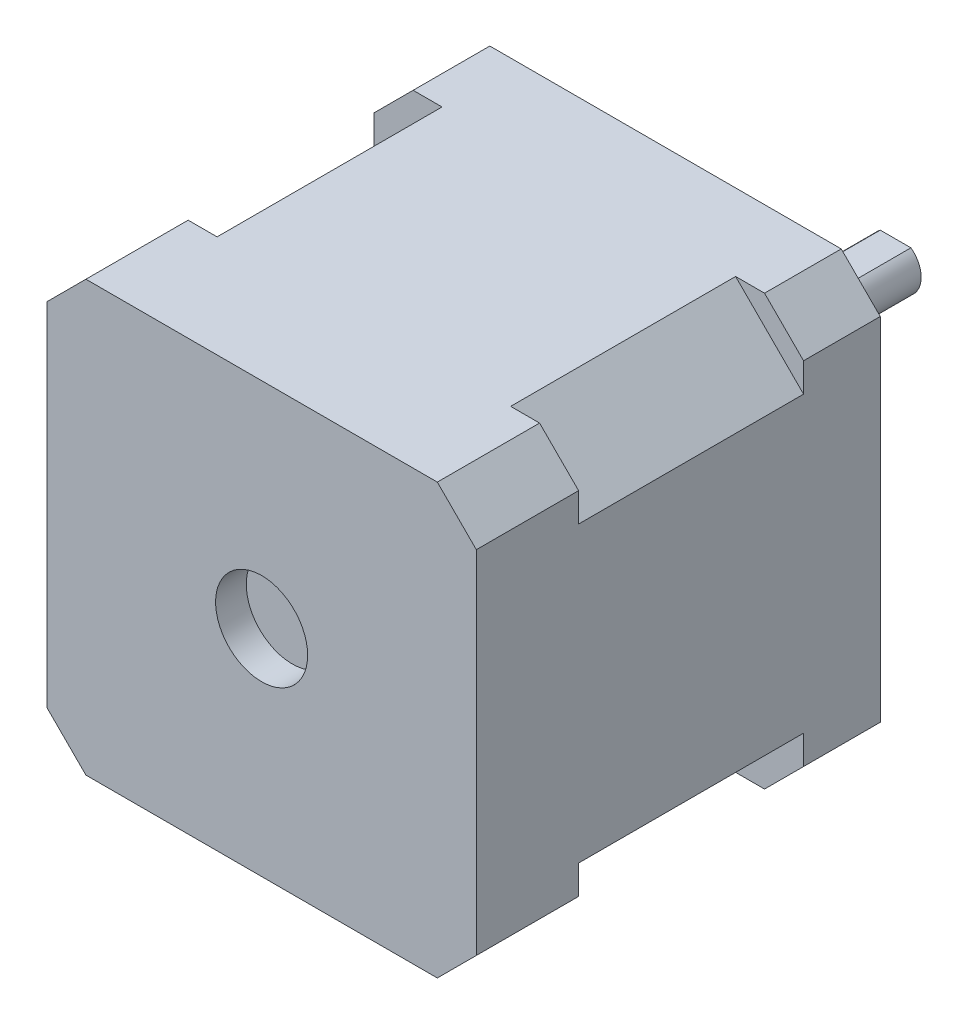
ISO-10303-21;
HEADER;
FILE_DESCRIPTION(('STEP AP214'),'2;1');
FILE_NAME('part.step','',(''),(''),'','','');
FILE_SCHEMA(('AUTOMOTIVE_DESIGN { 1 0 10303 214 1 1 1 1 }'));
ENDSEC;
DATA;
#1=APPLICATION_CONTEXT('core data for automotive mechanical design processes');
#2=APPLICATION_PROTOCOL_DEFINITION('international standard','automotive_design',2000,#1);
#3=PRODUCT_CONTEXT('',#1,'mechanical');
#4=PRODUCT('Part','Part','',(#3));
#5=PRODUCT_RELATED_PRODUCT_CATEGORY('part','',(#4));
#6=PRODUCT_DEFINITION_FORMATION('','',#4);
#7=PRODUCT_DEFINITION_CONTEXT('part definition',#1,'design');
#8=PRODUCT_DEFINITION('design','',#6,#7);
#9=PRODUCT_DEFINITION_SHAPE('','',#8);
#10=(LENGTH_UNIT() NAMED_UNIT(*) SI_UNIT(.MILLI.,.METRE.));
#11=(NAMED_UNIT(*) PLANE_ANGLE_UNIT() SI_UNIT($,.RADIAN.));
#12=(NAMED_UNIT(*) SI_UNIT($,.STERADIAN.) SOLID_ANGLE_UNIT());
#13=UNCERTAINTY_MEASURE_WITH_UNIT(LENGTH_MEASURE(1.E-05),#10,'distance_accuracy_value','');
#14=(GEOMETRIC_REPRESENTATION_CONTEXT(3) GLOBAL_UNCERTAINTY_ASSIGNED_CONTEXT((#13)) GLOBAL_UNIT_ASSIGNED_CONTEXT((#10,
#11,#12)) REPRESENTATION_CONTEXT('',''));
#15=CARTESIAN_POINT('',(0.,0.,0.));
#16=DIRECTION('',(0.,0.,1.));
#17=DIRECTION('',(1.,0.,0.));
#18=AXIS2_PLACEMENT_3D('',#15,#16,#17);
#19=CARTESIAN_POINT('',(21.,17.1837661840736,39.5));
#20=DIRECTION('',(-0.707106781186551,-0.707106781186544,0.));
#21=DIRECTION('',(0.707106781186544,-0.707106781186551,0.));
#22=AXIS2_PLACEMENT_3D('',#19,#20,#21);
#23=PLANE('',#22);
#24=DIRECTION('',(0.707106781186544,-0.707106781186551,0.));
#25=VECTOR('',#24,1.);
#26=CARTESIAN_POINT('',(21.,17.1837661840736,29.5));
#27=LINE('',#26,#25);
#28=CARTESIAN_POINT('',(17.1837661840736,21.,29.5));
#29=VERTEX_POINT('',#28);
#30=CARTESIAN_POINT('',(21.,17.1837661840736,29.5));
#31=VERTEX_POINT('',#30);
#32=EDGE_CURVE('E392',#29,#31,#27,.T.);
#33=ORIENTED_EDGE('',*,*,#32,.F.);
#34=DIRECTION('',(0.,0.,-1.));
#35=VECTOR('',#34,1.);
#36=CARTESIAN_POINT('',(17.1837661840736,21.,39.5));
#37=LINE('',#36,#35);
#38=CARTESIAN_POINT('',(17.1837661840736,21.,39.5));
#39=VERTEX_POINT('',#38);
#40=EDGE_CURVE('E309',#39,#29,#37,.T.);
#41=ORIENTED_EDGE('',*,*,#40,.F.);
#42=DIRECTION('',(-0.707106781186544,0.707106781186551,0.));
#43=VECTOR('',#42,1.);
#44=CARTESIAN_POINT('',(21.,17.1837661840736,39.5));
#45=LINE('',#44,#43);
#46=CARTESIAN_POINT('',(21.,17.1837661840736,39.5));
#47=VERTEX_POINT('',#46);
#48=EDGE_CURVE('E310',#47,#39,#45,.T.);
#49=ORIENTED_EDGE('',*,*,#48,.F.);
#50=DIRECTION('',(0.,0.,-1.));
#51=VECTOR('',#50,1.);
#52=CARTESIAN_POINT('',(21.,17.1837661840736,39.5));
#53=LINE('',#52,#51);
#54=EDGE_CURVE('E350',#47,#31,#53,.T.);
#55=ORIENTED_EDGE('',*,*,#54,.T.);
#56=EDGE_LOOP('',(#33,#41,#49,#55));
#57=FACE_BOUND('',#56,.T.);
#58=ADVANCED_FACE('F40',(#57),#23,.F.);
#59=CARTESIAN_POINT('',(-21.,17.1837661840736,39.5));
#60=DIRECTION('',(0.707106781186548,-0.707106781186548,0.));
#61=DIRECTION('',(0.707106781186548,0.707106781186548,0.));
#62=AXIS2_PLACEMENT_3D('',#59,#60,#61);
#63=PLANE('',#62);
#64=DIRECTION('',(0.707106781186548,0.707106781186548,0.));
#65=VECTOR('',#64,1.);
#66=CARTESIAN_POINT('',(-21.,17.1837661840736,29.5));
#67=LINE('',#66,#65);
#68=CARTESIAN_POINT('',(-21.,17.1837661840736,29.5));
#69=VERTEX_POINT('',#68);
#70=CARTESIAN_POINT('',(-17.1837661840736,21.,29.5));
#71=VERTEX_POINT('',#70);
#72=EDGE_CURVE('E428',#69,#71,#67,.T.);
#73=ORIENTED_EDGE('',*,*,#72,.F.);
#74=DIRECTION('',(0.,0.,-1.));
#75=VECTOR('',#74,1.);
#76=CARTESIAN_POINT('',(-21.,17.1837661840736,39.5));
#77=LINE('',#76,#75);
#78=CARTESIAN_POINT('',(-21.,17.1837661840736,39.5));
#79=VERTEX_POINT('',#78);
#80=EDGE_CURVE('E369',#79,#69,#77,.T.);
#81=ORIENTED_EDGE('',*,*,#80,.F.);
#82=DIRECTION('',(-0.707106781186548,-0.707106781186548,0.));
#83=VECTOR('',#82,1.);
#84=CARTESIAN_POINT('',(-21.,17.1837661840736,39.5));
#85=LINE('',#84,#83);
#86=CARTESIAN_POINT('',(-17.1837661840736,21.,39.5));
#87=VERTEX_POINT('',#86);
#88=EDGE_CURVE('E316',#87,#79,#85,.T.);
#89=ORIENTED_EDGE('',*,*,#88,.F.);
#90=DIRECTION('',(0.,0.,-1.));
#91=VECTOR('',#90,1.);
#92=CARTESIAN_POINT('',(-17.1837661840736,21.,39.5));
#93=LINE('',#92,#91);
#94=EDGE_CURVE('E373',#87,#71,#93,.T.);
#95=ORIENTED_EDGE('',*,*,#94,.T.);
#96=EDGE_LOOP('',(#73,#81,#89,#95));
#97=FACE_BOUND('',#96,.T.);
#98=ADVANCED_FACE('F523',(#97),#63,.F.);
#99=CARTESIAN_POINT('',(-17.1837661840736,-21.,39.5));
#100=DIRECTION('',(0.707106781186548,0.707106781186548,0.));
#101=DIRECTION('',(-0.707106781186548,0.707106781186548,0.));
#102=AXIS2_PLACEMENT_3D('',#99,#100,#101);
#103=PLANE('',#102);
#104=DIRECTION('',(-0.707106781186548,0.707106781186548,0.));
#105=VECTOR('',#104,1.);
#106=CARTESIAN_POINT('',(-17.1837661840736,-21.,29.5));
#107=LINE('',#106,#105);
#108=CARTESIAN_POINT('',(-17.1837661840736,-21.,29.5));
#109=VERTEX_POINT('',#108);
#110=CARTESIAN_POINT('',(-21.,-17.1837661840736,29.5));
#111=VERTEX_POINT('',#110);
#112=EDGE_CURVE('E423',#109,#111,#107,.T.);
#113=ORIENTED_EDGE('',*,*,#112,.F.);
#114=DIRECTION('',(0.,0.,-1.));
#115=VECTOR('',#114,1.);
#116=CARTESIAN_POINT('',(-17.1837661840736,-21.,39.5));
#117=LINE('',#116,#115);
#118=CARTESIAN_POINT('',(-17.1837661840736,-21.,39.5));
#119=VERTEX_POINT('',#118);
#120=EDGE_CURVE('E362',#119,#109,#117,.T.);
#121=ORIENTED_EDGE('',*,*,#120,.F.);
#122=DIRECTION('',(0.707106781186548,-0.707106781186548,0.));
#123=VECTOR('',#122,1.);
#124=CARTESIAN_POINT('',(-17.1837661840736,-21.,39.5));
#125=LINE('',#124,#123);
#126=CARTESIAN_POINT('',(-21.,-17.1837661840736,39.5));
#127=VERTEX_POINT('',#126);
#128=EDGE_CURVE('E320',#127,#119,#125,.T.);
#129=ORIENTED_EDGE('',*,*,#128,.F.);
#130=DIRECTION('',(0.,0.,-1.));
#131=VECTOR('',#130,1.);
#132=CARTESIAN_POINT('',(-21.,-17.1837661840736,39.5));
#133=LINE('',#132,#131);
#134=EDGE_CURVE('E365',#127,#111,#133,.T.);
#135=ORIENTED_EDGE('',*,*,#134,.T.);
#136=EDGE_LOOP('',(#113,#121,#129,#135));
#137=FACE_BOUND('',#136,.T.);
#138=ADVANCED_FACE('F514',(#137),#103,.F.);
#139=CARTESIAN_POINT('',(17.1837661840735,-21.,39.5));
#140=DIRECTION('',(-0.707106781186548,0.707106781186548,0.));
#141=DIRECTION('',(-0.707106781186548,-0.707106781186548,0.));
#142=AXIS2_PLACEMENT_3D('',#139,#140,#141);
#143=PLANE('',#142);
#144=DIRECTION('',(-0.707106781186548,-0.707106781186548,0.));
#145=VECTOR('',#144,1.);
#146=CARTESIAN_POINT('',(17.1837661840735,-21.,29.5));
#147=LINE('',#146,#145);
#148=CARTESIAN_POINT('',(21.,-17.1837661840735,29.5));
#149=VERTEX_POINT('',#148);
#150=CARTESIAN_POINT('',(17.1837661840735,-21.,29.5));
#151=VERTEX_POINT('',#150);
#152=EDGE_CURVE('E413',#149,#151,#147,.T.);
#153=ORIENTED_EDGE('',*,*,#152,.F.);
#154=DIRECTION('',(0.,0.,-1.));
#155=VECTOR('',#154,1.);
#156=CARTESIAN_POINT('',(21.,-17.1837661840735,39.5));
#157=LINE('',#156,#155);
#158=CARTESIAN_POINT('',(21.,-17.1837661840735,39.5));
#159=VERTEX_POINT('',#158);
#160=EDGE_CURVE('E354',#159,#149,#157,.T.);
#161=ORIENTED_EDGE('',*,*,#160,.F.);
#162=DIRECTION('',(0.707106781186548,0.707106781186548,0.));
#163=VECTOR('',#162,1.);
#164=CARTESIAN_POINT('',(17.1837661840735,-21.,39.5));
#165=LINE('',#164,#163);
#166=CARTESIAN_POINT('',(17.1837661840735,-21.,39.5));
#167=VERTEX_POINT('',#166);
#168=EDGE_CURVE('E324',#167,#159,#165,.T.);
#169=ORIENTED_EDGE('',*,*,#168,.F.);
#170=DIRECTION('',(0.,0.,-1.));
#171=VECTOR('',#170,1.);
#172=CARTESIAN_POINT('',(17.1837661840735,-21.,39.5));
#173=LINE('',#172,#171);
#174=EDGE_CURVE('E358',#167,#151,#173,.T.);
#175=ORIENTED_EDGE('',*,*,#174,.T.);
#176=EDGE_LOOP('',(#153,#161,#169,#175));
#177=FACE_BOUND('',#176,.T.);
#178=ADVANCED_FACE('F483',(#177),#143,.F.);
#179=CARTESIAN_POINT('',(17.1837661840736,21.,7.5));
#180=VERTEX_POINT('',#179);
#181=CARTESIAN_POINT('',(17.1837661840736,21.,0.));
#182=VERTEX_POINT('',#181);
#183=EDGE_CURVE('E376',#180,#182,#37,.T.);
#184=ORIENTED_EDGE('',*,*,#183,.F.);
#185=DIRECTION('',(0.707106781186544,-0.707106781186551,0.));
#186=VECTOR('',#185,1.);
#187=CARTESIAN_POINT('',(21.,17.1837661840736,7.5));
#188=LINE('',#187,#186);
#189=CARTESIAN_POINT('',(21.,17.1837661840736,7.5));
#190=VERTEX_POINT('',#189);
#191=EDGE_CURVE('E436',#180,#190,#188,.T.);
#192=ORIENTED_EDGE('',*,*,#191,.T.);
#193=CARTESIAN_POINT('',(21.,17.1837661840736,0.));
#194=VERTEX_POINT('',#193);
#195=EDGE_CURVE('E328',#190,#194,#53,.T.);
#196=ORIENTED_EDGE('',*,*,#195,.T.);
#197=DIRECTION('',(-0.707106781186544,0.707106781186551,0.));
#198=VECTOR('',#197,1.);
#199=CARTESIAN_POINT('',(21.,17.1837661840736,0.));
#200=LINE('',#199,#198);
#201=EDGE_CURVE('E304',#194,#182,#200,.T.);
#202=ORIENTED_EDGE('',*,*,#201,.T.);
#203=EDGE_LOOP('',(#184,#192,#196,#202));
#204=FACE_BOUND('',#203,.T.);
#205=ADVANCED_FACE('F42',(#204),#23,.F.);
#206=CARTESIAN_POINT('',(-17.1837661840736,21.,39.5));
#207=DIRECTION('',(0.,-1.,0.));
#208=DIRECTION('',(1.,0.,0.));
#209=AXIS2_PLACEMENT_3D('',#206,#207,#208);
#210=PLANE('',#209);
#211=CARTESIAN_POINT('',(-17.1837661840736,21.,7.5));
#212=VERTEX_POINT('',#211);
#213=CARTESIAN_POINT('',(-17.1837661840736,21.,0.));
#214=VERTEX_POINT('',#213);
#215=EDGE_CURVE('E372',#212,#214,#93,.T.);
#216=ORIENTED_EDGE('',*,*,#215,.F.);
#217=DIRECTION('',(1.,0.,0.));
#218=VECTOR('',#217,1.);
#219=CARTESIAN_POINT('',(-17.1837661840736,21.,7.5));
#220=LINE('',#219,#218);
#221=CARTESIAN_POINT('',(-14.3553390593274,21.,7.5));
#222=VERTEX_POINT('',#221);
#223=EDGE_CURVE('E246',#212,#222,#220,.T.);
#224=ORIENTED_EDGE('',*,*,#223,.T.);
#225=DIRECTION('',(0.,0.,1.));
#226=VECTOR('',#225,1.);
#227=CARTESIAN_POINT('',(-14.3553390593274,21.,7.5));
#228=LINE('',#227,#226);
#229=CARTESIAN_POINT('',(-14.3553390593274,21.,29.5));
#230=VERTEX_POINT('',#229);
#231=EDGE_CURVE('E404',#222,#230,#228,.T.);
#232=ORIENTED_EDGE('',*,*,#231,.T.);
#233=DIRECTION('',(1.,0.,0.));
#234=VECTOR('',#233,1.);
#235=CARTESIAN_POINT('',(-17.1837661840736,21.,29.5));
#236=LINE('',#235,#234);
#237=EDGE_CURVE('E422',#71,#230,#236,.T.);
#238=ORIENTED_EDGE('',*,*,#237,.F.);
#239=ORIENTED_EDGE('',*,*,#94,.F.);
#240=DIRECTION('',(-1.,0.,0.));
#241=VECTOR('',#240,1.);
#242=CARTESIAN_POINT('',(-17.1837661840736,21.,39.5));
#243=LINE('',#242,#241);
#244=EDGE_CURVE('E313',#39,#87,#243,.T.);
#245=ORIENTED_EDGE('',*,*,#244,.F.);
#246=ORIENTED_EDGE('',*,*,#40,.T.);
#247=CARTESIAN_POINT('',(14.3553390593274,21.,29.5));
#248=VERTEX_POINT('',#247);
#249=EDGE_CURVE('E420',#248,#29,#236,.T.);
#250=ORIENTED_EDGE('',*,*,#249,.F.);
#251=DIRECTION('',(0.,0.,1.));
#252=VECTOR('',#251,1.);
#253=CARTESIAN_POINT('',(14.3553390593274,21.,7.5));
#254=LINE('',#253,#252);
#255=CARTESIAN_POINT('',(14.3553390593274,21.,7.5));
#256=VERTEX_POINT('',#255);
#257=EDGE_CURVE('E401',#256,#248,#254,.T.);
#258=ORIENTED_EDGE('',*,*,#257,.F.);
#259=EDGE_CURVE('E438',#256,#180,#220,.T.);
#260=ORIENTED_EDGE('',*,*,#259,.T.);
#261=ORIENTED_EDGE('',*,*,#183,.T.);
#262=DIRECTION('',(-1.,0.,0.));
#263=VECTOR('',#262,1.);
#264=CARTESIAN_POINT('',(-17.1837661840736,21.,0.));
#265=LINE('',#264,#263);
#266=EDGE_CURVE('E331',#182,#214,#265,.T.);
#267=ORIENTED_EDGE('',*,*,#266,.T.);
#268=EDGE_LOOP('',(#216,#224,#232,#238,#239,#245,#246,#250,#258,#260,#261,#267));
#269=FACE_BOUND('',#268,.T.);
#270=ADVANCED_FACE('F446',(#269),#210,.F.);
#271=CARTESIAN_POINT('',(-21.,17.1837661840736,7.5));
#272=VERTEX_POINT('',#271);
#273=CARTESIAN_POINT('',(-21.,17.1837661840736,0.));
#274=VERTEX_POINT('',#273);
#275=EDGE_CURVE('E368',#272,#274,#77,.T.);
#276=ORIENTED_EDGE('',*,*,#275,.F.);
#277=DIRECTION('',(0.707106781186548,0.707106781186548,0.));
#278=VECTOR('',#277,1.);
#279=CARTESIAN_POINT('',(-21.,17.1837661840736,7.5));
#280=LINE('',#279,#278);
#281=EDGE_CURVE('E240',#272,#212,#280,.T.);
#282=ORIENTED_EDGE('',*,*,#281,.T.);
#283=ORIENTED_EDGE('',*,*,#215,.T.);
#284=DIRECTION('',(-0.707106781186548,-0.707106781186548,0.));
#285=VECTOR('',#284,1.);
#286=CARTESIAN_POINT('',(-21.,17.1837661840736,0.));
#287=LINE('',#286,#285);
#288=EDGE_CURVE('E334',#214,#274,#287,.T.);
#289=ORIENTED_EDGE('',*,*,#288,.T.);
#290=EDGE_LOOP('',(#276,#282,#283,#289));
#291=FACE_BOUND('',#290,.T.);
#292=ADVANCED_FACE('F452',(#291),#63,.F.);
#293=CARTESIAN_POINT('',(-21.,17.1837661840736,39.5));
#294=DIRECTION('',(1.,0.,0.));
#295=DIRECTION('',(0.,1.,0.));
#296=AXIS2_PLACEMENT_3D('',#293,#294,#295);
#297=PLANE('',#296);
#298=CARTESIAN_POINT('',(-21.,-17.1837661840736,7.5));
#299=VERTEX_POINT('',#298);
#300=CARTESIAN_POINT('',(-21.,-17.1837661840736,0.));
#301=VERTEX_POINT('',#300);
#302=EDGE_CURVE('E235',#299,#301,#133,.T.);
#303=ORIENTED_EDGE('',*,*,#302,.F.);
#304=DIRECTION('',(0.,1.,0.));
#305=VECTOR('',#304,1.);
#306=CARTESIAN_POINT('',(-21.,17.1837661840736,7.5));
#307=LINE('',#306,#305);
#308=CARTESIAN_POINT('',(-21.,-14.3553390593274,7.5));
#309=VERTEX_POINT('',#308);
#310=EDGE_CURVE('E224',#299,#309,#307,.T.);
#311=ORIENTED_EDGE('',*,*,#310,.T.);
#312=DIRECTION('',(0.,0.,1.));
#313=VECTOR('',#312,1.);
#314=CARTESIAN_POINT('',(-21.,-14.3553390593274,7.5));
#315=LINE('',#314,#313);
#316=CARTESIAN_POINT('',(-21.,-14.3553390593274,29.5));
#317=VERTEX_POINT('',#316);
#318=EDGE_CURVE('E213',#309,#317,#315,.T.);
#319=ORIENTED_EDGE('',*,*,#318,.T.);
#320=DIRECTION('',(0.,1.,0.));
#321=VECTOR('',#320,1.);
#322=CARTESIAN_POINT('',(-21.,17.1837661840736,29.5));
#323=LINE('',#322,#321);
#324=EDGE_CURVE('E425',#111,#317,#323,.T.);
#325=ORIENTED_EDGE('',*,*,#324,.F.);
#326=ORIENTED_EDGE('',*,*,#134,.F.);
#327=DIRECTION('',(0.,-1.,0.));
#328=VECTOR('',#327,1.);
#329=CARTESIAN_POINT('',(-21.,17.1837661840736,39.5));
#330=LINE('',#329,#328);
#331=EDGE_CURVE('E318',#79,#127,#330,.T.);
#332=ORIENTED_EDGE('',*,*,#331,.F.);
#333=ORIENTED_EDGE('',*,*,#80,.T.);
#334=CARTESIAN_POINT('',(-21.,14.3553390593274,29.5));
#335=VERTEX_POINT('',#334);
#336=EDGE_CURVE('E427',#335,#69,#323,.T.);
#337=ORIENTED_EDGE('',*,*,#336,.F.);
#338=DIRECTION('',(0.,0.,1.));
#339=VECTOR('',#338,1.);
#340=CARTESIAN_POINT('',(-21.,14.3553390593274,7.5));
#341=LINE('',#340,#339);
#342=CARTESIAN_POINT('',(-21.,14.3553390593274,7.5));
#343=VERTEX_POINT('',#342);
#344=EDGE_CURVE('E416',#343,#335,#341,.T.);
#345=ORIENTED_EDGE('',*,*,#344,.F.);
#346=EDGE_CURVE('E236',#343,#272,#307,.T.);
#347=ORIENTED_EDGE('',*,*,#346,.T.);
#348=ORIENTED_EDGE('',*,*,#275,.T.);
#349=DIRECTION('',(0.,-1.,0.));
#350=VECTOR('',#349,1.);
#351=CARTESIAN_POINT('',(-21.,17.1837661840736,0.));
#352=LINE('',#351,#350);
#353=EDGE_CURVE('E337',#274,#301,#352,.T.);
#354=ORIENTED_EDGE('',*,*,#353,.T.);
#355=EDGE_LOOP('',(#303,#311,#319,#325,#326,#332,#333,#337,#345,#347,#348,#354));
#356=FACE_BOUND('',#355,.T.);
#357=ADVANCED_FACE('F233',(#356),#297,.F.);
#358=CARTESIAN_POINT('',(-17.1837661840736,-21.,7.5));
#359=VERTEX_POINT('',#358);
#360=CARTESIAN_POINT('',(-17.1837661840736,-21.,0.));
#361=VERTEX_POINT('',#360);
#362=EDGE_CURVE('E361',#359,#361,#117,.T.);
#363=ORIENTED_EDGE('',*,*,#362,.F.);
#364=DIRECTION('',(-0.707106781186548,0.707106781186548,0.));
#365=VECTOR('',#364,1.);
#366=CARTESIAN_POINT('',(-17.1837661840736,-21.,7.5));
#367=LINE('',#366,#365);
#368=EDGE_CURVE('E237',#359,#299,#367,.T.);
#369=ORIENTED_EDGE('',*,*,#368,.T.);
#370=ORIENTED_EDGE('',*,*,#302,.T.);
#371=DIRECTION('',(0.707106781186548,-0.707106781186548,0.));
#372=VECTOR('',#371,1.);
#373=CARTESIAN_POINT('',(-17.1837661840736,-21.,0.));
#374=LINE('',#373,#372);
#375=EDGE_CURVE('E339',#301,#361,#374,.T.);
#376=ORIENTED_EDGE('',*,*,#375,.T.);
#377=EDGE_LOOP('',(#363,#369,#370,#376));
#378=FACE_BOUND('',#377,.T.);
#379=ADVANCED_FACE('F549',(#378),#103,.F.);
#380=CARTESIAN_POINT('',(17.1837661840735,-21.,39.5));
#381=DIRECTION('',(0.,1.,0.));
#382=DIRECTION('',(-1.,0.,0.));
#383=AXIS2_PLACEMENT_3D('',#380,#381,#382);
#384=PLANE('',#383);
#385=CARTESIAN_POINT('',(17.1837661840735,-21.,7.5));
#386=VERTEX_POINT('',#385);
#387=CARTESIAN_POINT('',(17.1837661840735,-21.,0.));
#388=VERTEX_POINT('',#387);
#389=EDGE_CURVE('E357',#386,#388,#173,.T.);
#390=ORIENTED_EDGE('',*,*,#389,.F.);
#391=DIRECTION('',(-1.,0.,0.));
#392=VECTOR('',#391,1.);
#393=CARTESIAN_POINT('',(17.1837661840735,-21.,7.5));
#394=LINE('',#393,#392);
#395=CARTESIAN_POINT('',(14.3553390593274,-21.,7.5));
#396=VERTEX_POINT('',#395);
#397=EDGE_CURVE('E433',#386,#396,#394,.T.);
#398=ORIENTED_EDGE('',*,*,#397,.T.);
#399=DIRECTION('',(0.,0.,1.));
#400=VECTOR('',#399,1.);
#401=CARTESIAN_POINT('',(14.3553390593274,-21.,7.5));
#402=LINE('',#401,#400);
#403=CARTESIAN_POINT('',(14.3553390593274,-21.,29.5));
#404=VERTEX_POINT('',#403);
#405=EDGE_CURVE('E406',#396,#404,#402,.T.);
#406=ORIENTED_EDGE('',*,*,#405,.T.);
#407=DIRECTION('',(-1.,0.,0.));
#408=VECTOR('',#407,1.);
#409=CARTESIAN_POINT('',(17.1837661840735,-21.,29.5));
#410=LINE('',#409,#408);
#411=EDGE_CURVE('E415',#151,#404,#410,.T.);
#412=ORIENTED_EDGE('',*,*,#411,.F.);
#413=ORIENTED_EDGE('',*,*,#174,.F.);
#414=DIRECTION('',(1.,0.,0.));
#415=VECTOR('',#414,1.);
#416=CARTESIAN_POINT('',(17.1837661840735,-21.,39.5));
#417=LINE('',#416,#415);
#418=EDGE_CURVE('E322',#119,#167,#417,.T.);
#419=ORIENTED_EDGE('',*,*,#418,.F.);
#420=ORIENTED_EDGE('',*,*,#120,.T.);
#421=CARTESIAN_POINT('',(-14.3553390593274,-21.,29.5));
#422=VERTEX_POINT('',#421);
#423=EDGE_CURVE('E418',#422,#109,#410,.T.);
#424=ORIENTED_EDGE('',*,*,#423,.F.);
#425=DIRECTION('',(0.,0.,1.));
#426=VECTOR('',#425,1.);
#427=CARTESIAN_POINT('',(-14.3553390593274,-21.,7.5));
#428=LINE('',#427,#426);
#429=CARTESIAN_POINT('',(-14.3553390593274,-21.,7.5));
#430=VERTEX_POINT('',#429);
#431=EDGE_CURVE('E220',#430,#422,#428,.T.);
#432=ORIENTED_EDGE('',*,*,#431,.F.);
#433=EDGE_CURVE('E227',#430,#359,#394,.T.);
#434=ORIENTED_EDGE('',*,*,#433,.T.);
#435=ORIENTED_EDGE('',*,*,#362,.T.);
#436=DIRECTION('',(1.,0.,0.));
#437=VECTOR('',#436,1.);
#438=CARTESIAN_POINT('',(17.1837661840735,-21.,0.));
#439=LINE('',#438,#437);
#440=EDGE_CURVE('E342',#361,#388,#439,.T.);
#441=ORIENTED_EDGE('',*,*,#440,.T.);
#442=EDGE_LOOP('',(#390,#398,#406,#412,#413,#419,#420,#424,#432,#434,#435,#441));
#443=FACE_BOUND('',#442,.T.);
#444=ADVANCED_FACE('F489',(#443),#384,.F.);
#445=CARTESIAN_POINT('',(21.,-17.1837661840735,7.5));
#446=VERTEX_POINT('',#445);
#447=CARTESIAN_POINT('',(21.,-17.1837661840735,0.));
#448=VERTEX_POINT('',#447);
#449=EDGE_CURVE('E353',#446,#448,#157,.T.);
#450=ORIENTED_EDGE('',*,*,#449,.F.);
#451=DIRECTION('',(-0.707106781186548,-0.707106781186548,0.));
#452=VECTOR('',#451,1.);
#453=CARTESIAN_POINT('',(17.1837661840735,-21.,7.5));
#454=LINE('',#453,#452);
#455=EDGE_CURVE('E430',#446,#386,#454,.T.);
#456=ORIENTED_EDGE('',*,*,#455,.T.);
#457=ORIENTED_EDGE('',*,*,#389,.T.);
#458=DIRECTION('',(0.707106781186548,0.707106781186548,0.));
#459=VECTOR('',#458,1.);
#460=CARTESIAN_POINT('',(17.1837661840735,-21.,0.));
#461=LINE('',#460,#459);
#462=EDGE_CURVE('E345',#388,#448,#461,.T.);
#463=ORIENTED_EDGE('',*,*,#462,.T.);
#464=EDGE_LOOP('',(#450,#456,#457,#463));
#465=FACE_BOUND('',#464,.T.);
#466=ADVANCED_FACE('F492',(#465),#143,.F.);
#467=CARTESIAN_POINT('',(21.,-17.1837661840735,39.5));
#468=DIRECTION('',(-1.,0.,0.));
#469=DIRECTION('',(0.,0.,1.));
#470=AXIS2_PLACEMENT_3D('',#467,#468,#469);
#471=PLANE('',#470);
#472=ORIENTED_EDGE('',*,*,#195,.F.);
#473=DIRECTION('',(0.,-1.,0.));
#474=VECTOR('',#473,1.);
#475=CARTESIAN_POINT('',(21.,-17.1837661840735,7.5));
#476=LINE('',#475,#474);
#477=CARTESIAN_POINT('',(21.,14.3553390593274,7.5));
#478=VERTEX_POINT('',#477);
#479=EDGE_CURVE('E11',#190,#478,#476,.T.);
#480=ORIENTED_EDGE('',*,*,#479,.T.);
#481=DIRECTION('',(0.,0.,1.));
#482=VECTOR('',#481,1.);
#483=CARTESIAN_POINT('',(21.,14.3553390593274,7.5));
#484=LINE('',#483,#482);
#485=CARTESIAN_POINT('',(21.,14.3553390593274,29.5));
#486=VERTEX_POINT('',#485);
#487=EDGE_CURVE('E395',#478,#486,#484,.T.);
#488=ORIENTED_EDGE('',*,*,#487,.T.);
#489=DIRECTION('',(0.,-1.,0.));
#490=VECTOR('',#489,1.);
#491=CARTESIAN_POINT('',(21.,-17.1837661840735,29.5));
#492=LINE('',#491,#490);
#493=EDGE_CURVE('E49',#31,#486,#492,.T.);
#494=ORIENTED_EDGE('',*,*,#493,.F.);
#495=ORIENTED_EDGE('',*,*,#54,.F.);
#496=DIRECTION('',(0.,1.,0.));
#497=VECTOR('',#496,1.);
#498=CARTESIAN_POINT('',(21.,-17.1837661840735,39.5));
#499=LINE('',#498,#497);
#500=EDGE_CURVE('E326',#159,#47,#499,.T.);
#501=ORIENTED_EDGE('',*,*,#500,.F.);
#502=ORIENTED_EDGE('',*,*,#160,.T.);
#503=CARTESIAN_POINT('',(21.,-14.3553390593274,29.5));
#504=VERTEX_POINT('',#503);
#505=EDGE_CURVE('E308',#504,#149,#492,.T.);
#506=ORIENTED_EDGE('',*,*,#505,.F.);
#507=DIRECTION('',(0.,0.,1.));
#508=VECTOR('',#507,1.);
#509=CARTESIAN_POINT('',(21.,-14.3553390593274,7.5));
#510=LINE('',#509,#508);
#511=CARTESIAN_POINT('',(21.,-14.3553390593274,7.5));
#512=VERTEX_POINT('',#511);
#513=EDGE_CURVE('E402',#512,#504,#510,.T.);
#514=ORIENTED_EDGE('',*,*,#513,.F.);
#515=EDGE_CURVE('E44',#512,#446,#476,.T.);
#516=ORIENTED_EDGE('',*,*,#515,.T.);
#517=ORIENTED_EDGE('',*,*,#449,.T.);
#518=DIRECTION('',(0.,1.,0.));
#519=VECTOR('',#518,1.);
#520=CARTESIAN_POINT('',(21.,-17.1837661840735,0.));
#521=LINE('',#520,#519);
#522=EDGE_CURVE('E314',#448,#194,#521,.T.);
#523=ORIENTED_EDGE('',*,*,#522,.T.);
#524=EDGE_LOOP('',(#472,#480,#488,#494,#495,#501,#502,#506,#514,#516,#517,#523));
#525=FACE_BOUND('',#524,.T.);
#526=ADVANCED_FACE('F397',(#525),#471,.F.);
#527=CARTESIAN_POINT('',(0.,0.,39.5));
#528=DIRECTION('',(0.,0.,-1.));
#529=DIRECTION('',(-1.,0.,0.));
#530=AXIS2_PLACEMENT_3D('',#527,#528,#529);
#531=PLANE('',#530);
#532=CARTESIAN_POINT('',(0.,0.,39.5));
#533=DIRECTION('',(0.,0.,1.));
#534=DIRECTION('',(1.,0.,0.));
#535=AXIS2_PLACEMENT_3D('',#532,#533,#534);
#536=CIRCLE('',#535,4.5);
#537=CARTESIAN_POINT('',(4.5,0.,39.5));
#538=VERTEX_POINT('',#537);
#539=EDGE_CURVE('E254',#538,#538,#536,.T.);
#540=ORIENTED_EDGE('',*,*,#539,.F.);
#541=EDGE_LOOP('',(#540));
#542=FACE_BOUND('',#541,.T.);
#543=ORIENTED_EDGE('',*,*,#48,.T.);
#544=ORIENTED_EDGE('',*,*,#244,.T.);
#545=ORIENTED_EDGE('',*,*,#88,.T.);
#546=ORIENTED_EDGE('',*,*,#331,.T.);
#547=ORIENTED_EDGE('',*,*,#128,.T.);
#548=ORIENTED_EDGE('',*,*,#418,.T.);
#549=ORIENTED_EDGE('',*,*,#168,.T.);
#550=ORIENTED_EDGE('',*,*,#500,.T.);
#551=EDGE_LOOP('',(#543,#544,#545,#546,#547,#548,#549,#550));
#552=FACE_BOUND('',#551,.T.);
#553=ADVANCED_FACE('F507',(#542,#552),#531,.F.);
#554=CARTESIAN_POINT('',(0.,0.,0.));
#555=DIRECTION('',(0.,0.,-1.));
#556=DIRECTION('',(-1.,0.,0.));
#557=AXIS2_PLACEMENT_3D('',#554,#555,#556);
#558=PLANE('',#557);
#559=CARTESIAN_POINT('',(-15.4999999999998,-15.5000000000002,0.));
#560=DIRECTION('',(0.,0.,-1.));
#561=DIRECTION('',(-1.,0.,0.));
#562=AXIS2_PLACEMENT_3D('',#559,#560,#561);
#563=CIRCLE('',#562,1.5);
#564=CARTESIAN_POINT('',(-16.9999999999998,-15.5000000000002,0.));
#565=VERTEX_POINT('',#564);
#566=EDGE_CURVE('E273',#565,#565,#563,.T.);
#567=ORIENTED_EDGE('',*,*,#566,.F.);
#568=EDGE_LOOP('',(#567));
#569=FACE_BOUND('',#568,.T.);
#570=CARTESIAN_POINT('',(-15.5000000000001,15.4999999999999,0.));
#571=DIRECTION('',(0.,0.,-1.));
#572=DIRECTION('',(-1.,0.,0.));
#573=AXIS2_PLACEMENT_3D('',#570,#571,#572);
#574=CIRCLE('',#573,1.5);
#575=CARTESIAN_POINT('',(-17.0000000000001,15.4999999999999,0.));
#576=VERTEX_POINT('',#575);
#577=EDGE_CURVE('E285',#576,#576,#574,.T.);
#578=ORIENTED_EDGE('',*,*,#577,.F.);
#579=EDGE_LOOP('',(#578));
#580=FACE_BOUND('',#579,.T.);
#581=CARTESIAN_POINT('',(15.5,15.5000000000001,0.));
#582=DIRECTION('',(0.,0.,-1.));
#583=DIRECTION('',(-1.,0.,0.));
#584=AXIS2_PLACEMENT_3D('',#581,#582,#583);
#585=CIRCLE('',#584,1.5);
#586=CARTESIAN_POINT('',(14.,15.5000000000001,0.));
#587=VERTEX_POINT('',#586);
#588=EDGE_CURVE('E279',#587,#587,#585,.T.);
#589=ORIENTED_EDGE('',*,*,#588,.F.);
#590=EDGE_LOOP('',(#589));
#591=FACE_BOUND('',#590,.T.);
#592=CARTESIAN_POINT('',(15.5,-15.5,0.));
#593=DIRECTION('',(0.,0.,-1.));
#594=DIRECTION('',(-1.,0.,0.));
#595=AXIS2_PLACEMENT_3D('',#592,#593,#594);
#596=CIRCLE('',#595,1.5);
#597=CARTESIAN_POINT('',(14.,-15.5,0.));
#598=VERTEX_POINT('',#597);
#599=EDGE_CURVE('E278',#598,#598,#596,.T.);
#600=ORIENTED_EDGE('',*,*,#599,.F.);
#601=EDGE_LOOP('',(#600));
#602=FACE_BOUND('',#601,.T.);
#603=CARTESIAN_POINT('',(0.,0.,0.));
#604=DIRECTION('',(0.,0.,-1.));
#605=DIRECTION('',(-1.,0.,0.));
#606=AXIS2_PLACEMENT_3D('',#603,#604,#605);
#607=CIRCLE('',#606,11.);
#608=CARTESIAN_POINT('',(-11.,0.,0.));
#609=VERTEX_POINT('',#608);
#610=EDGE_CURVE('E305',#609,#609,#607,.T.);
#611=ORIENTED_EDGE('',*,*,#610,.F.);
#612=EDGE_LOOP('',(#611));
#613=FACE_BOUND('',#612,.T.);
#614=ORIENTED_EDGE('',*,*,#201,.F.);
#615=ORIENTED_EDGE('',*,*,#522,.F.);
#616=ORIENTED_EDGE('',*,*,#462,.F.);
#617=ORIENTED_EDGE('',*,*,#440,.F.);
#618=ORIENTED_EDGE('',*,*,#375,.F.);
#619=ORIENTED_EDGE('',*,*,#353,.F.);
#620=ORIENTED_EDGE('',*,*,#288,.F.);
#621=ORIENTED_EDGE('',*,*,#266,.F.);
#622=EDGE_LOOP('',(#614,#615,#616,#617,#618,#619,#620,#621));
#623=FACE_BOUND('',#622,.T.);
#624=ADVANCED_FACE('F498',(#569,#580,#591,#602,#613,#623),#558,.T.);
#625=CARTESIAN_POINT('',(0.,0.,-2.));
#626=DIRECTION('',(0.,0.,1.));
#627=DIRECTION('',(1.,0.,0.));
#628=AXIS2_PLACEMENT_3D('',#625,#626,#627);
#629=CYLINDRICAL_SURFACE('',#628,11.);
#630=CARTESIAN_POINT('',(0.,0.,-2.));
#631=DIRECTION('',(0.,0.,-1.));
#632=DIRECTION('',(-1.,0.,0.));
#633=AXIS2_PLACEMENT_3D('',#630,#631,#632);
#634=CIRCLE('',#633,11.);
#635=CARTESIAN_POINT('',(-11.,0.,-2.));
#636=VERTEX_POINT('',#635);
#637=EDGE_CURVE('E301',#636,#636,#634,.T.);
#638=ORIENTED_EDGE('',*,*,#637,.F.);
#639=EDGE_LOOP('',(#638));
#640=FACE_BOUND('',#639,.T.);
#641=ORIENTED_EDGE('',*,*,#610,.T.);
#642=EDGE_LOOP('',(#641));
#643=FACE_BOUND('',#642,.T.);
#644=ADVANCED_FACE('F697',(#640,#643),#629,.T.);
#645=CARTESIAN_POINT('',(0.,0.,-2.));
#646=DIRECTION('',(0.,0.,-1.));
#647=DIRECTION('',(-1.,0.,0.));
#648=AXIS2_PLACEMENT_3D('',#645,#646,#647);
#649=PLANE('',#648);
#650=CARTESIAN_POINT('',(0.,0.,-2.));
#651=DIRECTION('',(0.,0.,-1.));
#652=DIRECTION('',(-1.,0.,0.));
#653=AXIS2_PLACEMENT_3D('',#650,#651,#652);
#654=CIRCLE('',#653,4.5);
#655=CARTESIAN_POINT('',(-4.5,0.,-2.));
#656=VERTEX_POINT('',#655);
#657=EDGE_CURVE('E250',#656,#656,#654,.T.);
#658=ORIENTED_EDGE('',*,*,#657,.F.);
#659=EDGE_LOOP('',(#658));
#660=FACE_BOUND('',#659,.T.);
#661=ORIENTED_EDGE('',*,*,#637,.T.);
#662=EDGE_LOOP('',(#661));
#663=FACE_BOUND('',#662,.T.);
#664=ADVANCED_FACE('F691',(#660,#663),#649,.T.);
#665=CARTESIAN_POINT('',(15.5,-15.5,5.));
#666=DIRECTION('',(0.,0.,-1.));
#667=DIRECTION('',(-1.,0.,0.));
#668=AXIS2_PLACEMENT_3D('',#665,#666,#667);
#669=CYLINDRICAL_SURFACE('',#668,1.5);
#670=CARTESIAN_POINT('',(15.5,-15.5,5.));
#671=DIRECTION('',(0.,0.,-1.));
#672=DIRECTION('',(-1.,0.,0.));
#673=AXIS2_PLACEMENT_3D('',#670,#671,#672);
#674=CIRCLE('',#673,1.5);
#675=CARTESIAN_POINT('',(14.,-15.5,5.));
#676=VERTEX_POINT('',#675);
#677=EDGE_CURVE('E293',#676,#676,#674,.T.);
#678=ORIENTED_EDGE('',*,*,#677,.F.);
#679=EDGE_LOOP('',(#678));
#680=FACE_BOUND('',#679,.T.);
#681=ORIENTED_EDGE('',*,*,#599,.T.);
#682=EDGE_LOOP('',(#681));
#683=FACE_BOUND('',#682,.T.);
#684=ADVANCED_FACE('F696',(#680,#683),#669,.F.);
#685=CARTESIAN_POINT('',(15.5,-15.5,5.));
#686=DIRECTION('',(0.,0.,-1.));
#687=DIRECTION('',(-1.,0.,0.));
#688=AXIS2_PLACEMENT_3D('',#685,#686,#687);
#689=PLANE('',#688);
#690=ORIENTED_EDGE('',*,*,#677,.T.);
#691=EDGE_LOOP('',(#690));
#692=FACE_BOUND('',#691,.T.);
#693=ADVANCED_FACE('F819',(#692),#689,.T.);
#694=CARTESIAN_POINT('',(15.5,15.5000000000001,5.));
#695=DIRECTION('',(0.,0.,-1.));
#696=DIRECTION('',(-1.,0.,0.));
#697=AXIS2_PLACEMENT_3D('',#694,#695,#696);
#698=CYLINDRICAL_SURFACE('',#697,1.5);
#699=CARTESIAN_POINT('',(15.5,15.5000000000001,5.));
#700=DIRECTION('',(0.,0.,-1.));
#701=DIRECTION('',(-1.,0.,0.));
#702=AXIS2_PLACEMENT_3D('',#699,#700,#701);
#703=CIRCLE('',#702,1.5);
#704=CARTESIAN_POINT('',(14.,15.5000000000001,5.));
#705=VERTEX_POINT('',#704);
#706=EDGE_CURVE('E275',#705,#705,#703,.T.);
#707=ORIENTED_EDGE('',*,*,#706,.F.);
#708=EDGE_LOOP('',(#707));
#709=FACE_BOUND('',#708,.T.);
#710=ORIENTED_EDGE('',*,*,#588,.T.);
#711=EDGE_LOOP('',(#710));
#712=FACE_BOUND('',#711,.T.);
#713=ADVANCED_FACE('F809',(#709,#712),#698,.F.);
#714=CARTESIAN_POINT('',(15.5,15.5000000000001,5.));
#715=DIRECTION('',(0.,0.,-1.));
#716=DIRECTION('',(-1.,0.,0.));
#717=AXIS2_PLACEMENT_3D('',#714,#715,#716);
#718=PLANE('',#717);
#719=ORIENTED_EDGE('',*,*,#706,.T.);
#720=EDGE_LOOP('',(#719));
#721=FACE_BOUND('',#720,.T.);
#722=ADVANCED_FACE('F799',(#721),#718,.T.);
#723=CARTESIAN_POINT('',(-15.5000000000001,15.4999999999999,5.));
#724=DIRECTION('',(0.,0.,-1.));
#725=DIRECTION('',(-1.,0.,0.));
#726=AXIS2_PLACEMENT_3D('',#723,#724,#725);
#727=CYLINDRICAL_SURFACE('',#726,1.5);
#728=CARTESIAN_POINT('',(-15.5000000000001,15.4999999999999,5.));
#729=DIRECTION('',(0.,0.,-1.));
#730=DIRECTION('',(-1.,0.,0.));
#731=AXIS2_PLACEMENT_3D('',#728,#729,#730);
#732=CIRCLE('',#731,1.5);
#733=CARTESIAN_POINT('',(-17.0000000000001,15.4999999999999,5.));
#734=VERTEX_POINT('',#733);
#735=EDGE_CURVE('E282',#734,#734,#732,.T.);
#736=ORIENTED_EDGE('',*,*,#735,.F.);
#737=EDGE_LOOP('',(#736));
#738=FACE_BOUND('',#737,.T.);
#739=ORIENTED_EDGE('',*,*,#577,.T.);
#740=EDGE_LOOP('',(#739));
#741=FACE_BOUND('',#740,.T.);
#742=ADVANCED_FACE('F789',(#738,#741),#727,.F.);
#743=CARTESIAN_POINT('',(-15.5000000000001,15.4999999999999,5.));
#744=DIRECTION('',(0.,0.,-1.));
#745=DIRECTION('',(-1.,0.,0.));
#746=AXIS2_PLACEMENT_3D('',#743,#744,#745);
#747=PLANE('',#746);
#748=ORIENTED_EDGE('',*,*,#735,.T.);
#749=EDGE_LOOP('',(#748));
#750=FACE_BOUND('',#749,.T.);
#751=ADVANCED_FACE('F779',(#750),#747,.T.);
#752=CARTESIAN_POINT('',(-15.4999999999998,-15.5000000000002,5.));
#753=DIRECTION('',(0.,0.,-1.));
#754=DIRECTION('',(-1.,0.,0.));
#755=AXIS2_PLACEMENT_3D('',#752,#753,#754);
#756=CYLINDRICAL_SURFACE('',#755,1.5);
#757=CARTESIAN_POINT('',(-15.4999999999998,-15.5000000000002,5.));
#758=DIRECTION('',(0.,0.,-1.));
#759=DIRECTION('',(-1.,0.,0.));
#760=AXIS2_PLACEMENT_3D('',#757,#758,#759);
#761=CIRCLE('',#760,1.5);
#762=CARTESIAN_POINT('',(-16.9999999999998,-15.5000000000002,5.));
#763=VERTEX_POINT('',#762);
#764=EDGE_CURVE('E288',#763,#763,#761,.T.);
#765=ORIENTED_EDGE('',*,*,#764,.F.);
#766=EDGE_LOOP('',(#765));
#767=FACE_BOUND('',#766,.T.);
#768=ORIENTED_EDGE('',*,*,#566,.T.);
#769=EDGE_LOOP('',(#768));
#770=FACE_BOUND('',#769,.T.);
#771=ADVANCED_FACE('F769',(#767,#770),#756,.F.);
#772=CARTESIAN_POINT('',(-15.4999999999998,-15.5000000000002,5.));
#773=DIRECTION('',(0.,0.,-1.));
#774=DIRECTION('',(-1.,0.,0.));
#775=AXIS2_PLACEMENT_3D('',#772,#773,#774);
#776=PLANE('',#775);
#777=ORIENTED_EDGE('',*,*,#764,.T.);
#778=EDGE_LOOP('',(#777));
#779=FACE_BOUND('',#778,.T.);
#780=ADVANCED_FACE('F718',(#779),#776,.T.);
#781=CARTESIAN_POINT('',(0.,0.,36.5));
#782=DIRECTION('',(0.,0.,1.));
#783=DIRECTION('',(1.,0.,0.));
#784=AXIS2_PLACEMENT_3D('',#781,#782,#783);
#785=CYLINDRICAL_SURFACE('',#784,4.5);
#786=CARTESIAN_POINT('',(0.,0.,36.5));
#787=DIRECTION('',(0.,0.,1.));
#788=DIRECTION('',(1.,0.,0.));
#789=AXIS2_PLACEMENT_3D('',#786,#787,#788);
#790=CIRCLE('',#789,4.5);
#791=CARTESIAN_POINT('',(4.5,0.,36.5));
#792=VERTEX_POINT('',#791);
#793=EDGE_CURVE('E257',#792,#792,#790,.T.);
#794=ORIENTED_EDGE('',*,*,#793,.F.);
#795=EDGE_LOOP('',(#794));
#796=FACE_BOUND('',#795,.T.);
#797=ORIENTED_EDGE('',*,*,#539,.T.);
#798=EDGE_LOOP('',(#797));
#799=FACE_BOUND('',#798,.T.);
#800=ADVANCED_FACE('F708',(#796,#799),#785,.F.);
#801=CARTESIAN_POINT('',(0.,0.,36.5));
#802=DIRECTION('',(0.,0.,1.));
#803=DIRECTION('',(1.,0.,0.));
#804=AXIS2_PLACEMENT_3D('',#801,#802,#803);
#805=PLANE('',#804);
#806=ORIENTED_EDGE('',*,*,#793,.T.);
#807=EDGE_LOOP('',(#806));
#808=FACE_BOUND('',#807,.T.);
#809=ADVANCED_FACE('F684',(#808),#805,.T.);
#810=CARTESIAN_POINT('',(0.,0.,1.));
#811=DIRECTION('',(0.,0.,-1.));
#812=DIRECTION('',(-1.,0.,0.));
#813=AXIS2_PLACEMENT_3D('',#810,#811,#812);
#814=CYLINDRICAL_SURFACE('',#813,4.5);
#815=CARTESIAN_POINT('',(0.,0.,1.));
#816=DIRECTION('',(0.,0.,-1.));
#817=DIRECTION('',(-1.,0.,0.));
#818=AXIS2_PLACEMENT_3D('',#815,#816,#817);
#819=CIRCLE('',#818,4.5);
#820=CARTESIAN_POINT('',(-4.5,0.,1.));
#821=VERTEX_POINT('',#820);
#822=EDGE_CURVE('E251',#821,#821,#819,.T.);
#823=ORIENTED_EDGE('',*,*,#822,.F.);
#824=EDGE_LOOP('',(#823));
#825=FACE_BOUND('',#824,.T.);
#826=ORIENTED_EDGE('',*,*,#657,.T.);
#827=EDGE_LOOP('',(#826));
#828=FACE_BOUND('',#827,.T.);
#829=ADVANCED_FACE('F672',(#825,#828),#814,.F.);
#830=CARTESIAN_POINT('',(0.,0.,1.));
#831=DIRECTION('',(0.,0.,-1.));
#832=DIRECTION('',(-1.,0.,0.));
#833=AXIS2_PLACEMENT_3D('',#830,#831,#832);
#834=PLANE('',#833);
#835=CARTESIAN_POINT('',(0.,0.,1.));
#836=DIRECTION('',(0.,0.,-1.));
#837=DIRECTION('',(-1.,0.,0.));
#838=AXIS2_PLACEMENT_3D('',#835,#836,#837);
#839=CIRCLE('',#838,2.5);
#840=CARTESIAN_POINT('',(-2.5,0.,1.));
#841=VERTEX_POINT('',#840);
#842=EDGE_CURVE('E247',#841,#841,#839,.T.);
#843=ORIENTED_EDGE('',*,*,#842,.F.);
#844=EDGE_LOOP('',(#843));
#845=FACE_BOUND('',#844,.T.);
#846=ORIENTED_EDGE('',*,*,#822,.T.);
#847=EDGE_LOOP('',(#846));
#848=FACE_BOUND('',#847,.T.);
#849=ADVANCED_FACE('F666',(#845,#848),#834,.T.);
#850=CARTESIAN_POINT('',(0.,0.,-4.5));
#851=DIRECTION('',(0.,0.,-1.));
#852=DIRECTION('',(-1.,0.,0.));
#853=AXIS2_PLACEMENT_3D('',#850,#851,#852);
#854=PLANE('',#853);
#855=CARTESIAN_POINT('',(0.,0.,-4.5));
#856=DIRECTION('',(0.,0.,-1.));
#857=DIRECTION('',(-1.,0.,0.));
#858=AXIS2_PLACEMENT_3D('',#855,#856,#857);
#859=CIRCLE('',#858,2.5);
#860=CARTESIAN_POINT('',(-1.5,2.,-4.5));
#861=VERTEX_POINT('',#860);
#862=CARTESIAN_POINT('',(1.5,2.,-4.5));
#863=VERTEX_POINT('',#862);
#864=EDGE_CURVE('E263',#861,#863,#859,.T.);
#865=ORIENTED_EDGE('',*,*,#864,.T.);
#866=DIRECTION('',(-1.,0.,0.));
#867=VECTOR('',#866,1.);
#868=CARTESIAN_POINT('',(-1.5,2.,-4.5));
#869=LINE('',#868,#867);
#870=EDGE_CURVE('E265',#863,#861,#869,.T.);
#871=ORIENTED_EDGE('',*,*,#870,.T.);
#872=EDGE_LOOP('',(#865,#871));
#873=FACE_BOUND('',#872,.T.);
#874=ADVANCED_FACE('F671',(#873),#854,.T.);
#875=CARTESIAN_POINT('',(-1.5,2.,-4.5));
#876=DIRECTION('',(0.,-1.,0.));
#877=DIRECTION('',(0.,0.,-1.));
#878=AXIS2_PLACEMENT_3D('',#875,#876,#877);
#879=PLANE('',#878);
#880=DIRECTION('',(-1.,0.,0.));
#881=VECTOR('',#880,1.);
#882=CARTESIAN_POINT('',(-1.5,2.,-22.5));
#883=LINE('',#882,#881);
#884=CARTESIAN_POINT('',(1.5,2.,-22.5));
#885=VERTEX_POINT('',#884);
#886=CARTESIAN_POINT('',(-1.5,2.,-22.5));
#887=VERTEX_POINT('',#886);
#888=EDGE_CURVE('E260',#885,#887,#883,.T.);
#889=ORIENTED_EDGE('',*,*,#888,.T.);
#890=DIRECTION('',(0.,0.,-1.));
#891=VECTOR('',#890,1.);
#892=CARTESIAN_POINT('',(-1.5,2.,-4.5));
#893=LINE('',#892,#891);
#894=EDGE_CURVE('E270',#861,#887,#893,.T.);
#895=ORIENTED_EDGE('',*,*,#894,.F.);
#896=ORIENTED_EDGE('',*,*,#870,.F.);
#897=DIRECTION('',(0.,0.,-1.));
#898=VECTOR('',#897,1.);
#899=CARTESIAN_POINT('',(1.5,2.,-4.5));
#900=LINE('',#899,#898);
#901=EDGE_CURVE('E268',#863,#885,#900,.T.);
#902=ORIENTED_EDGE('',*,*,#901,.T.);
#903=EDGE_LOOP('',(#889,#895,#896,#902));
#904=FACE_BOUND('',#903,.T.);
#905=ADVANCED_FACE('F740',(#904),#879,.F.);
#906=CARTESIAN_POINT('',(0.,0.,-22.5));
#907=DIRECTION('',(0.,0.,-1.));
#908=DIRECTION('',(-1.,0.,0.));
#909=AXIS2_PLACEMENT_3D('',#906,#907,#908);
#910=PLANE('',#909);
#911=ORIENTED_EDGE('',*,*,#888,.F.);
#912=CARTESIAN_POINT('',(0.,0.,-22.5));
#913=DIRECTION('',(0.,0.,-1.));
#914=DIRECTION('',(-1.,0.,0.));
#915=AXIS2_PLACEMENT_3D('',#912,#913,#914);
#916=CIRCLE('',#915,2.5);
#917=EDGE_CURVE('E296',#885,#887,#916,.T.);
#918=ORIENTED_EDGE('',*,*,#917,.T.);
#919=EDGE_LOOP('',(#911,#918));
#920=FACE_BOUND('',#919,.T.);
#921=ADVANCED_FACE('F656',(#920),#910,.T.);
#922=CARTESIAN_POINT('',(0.,0.,-22.5));
#923=DIRECTION('',(0.,0.,1.));
#924=DIRECTION('',(1.,0.,0.));
#925=AXIS2_PLACEMENT_3D('',#922,#923,#924);
#926=CYLINDRICAL_SURFACE('',#925,2.5);
#927=ORIENTED_EDGE('',*,*,#917,.F.);
#928=ORIENTED_EDGE('',*,*,#901,.F.);
#929=ORIENTED_EDGE('',*,*,#864,.F.);
#930=ORIENTED_EDGE('',*,*,#894,.T.);
#931=EDGE_LOOP('',(#927,#928,#929,#930));
#932=FACE_BOUND('',#931,.T.);
#933=ORIENTED_EDGE('',*,*,#842,.T.);
#934=EDGE_LOOP('',(#933));
#935=FACE_BOUND('',#934,.T.);
#936=ADVANCED_FACE('F620',(#932,#935),#926,.T.);
#937=CARTESIAN_POINT('',(14.3553390593274,-21.,7.5));
#938=DIRECTION('',(0.707106781186547,-0.707106781186548,0.));
#939=DIRECTION('',(0.707106781186548,0.707106781186547,0.));
#940=AXIS2_PLACEMENT_3D('',#937,#938,#939);
#941=PLANE('',#940);
#942=DIRECTION('',(0.707106781186548,0.707106781186547,0.));
#943=VECTOR('',#942,1.);
#944=CARTESIAN_POINT('',(14.3553390593274,-21.,29.5));
#945=LINE('',#944,#943);
#946=EDGE_CURVE('E464',#404,#504,#945,.T.);
#947=ORIENTED_EDGE('',*,*,#946,.F.);
#948=ORIENTED_EDGE('',*,*,#405,.F.);
#949=DIRECTION('',(0.707106781186548,0.707106781186547,0.));
#950=VECTOR('',#949,1.);
#951=CARTESIAN_POINT('',(14.3553390593274,-21.,7.5));
#952=LINE('',#951,#950);
#953=EDGE_CURVE('E229',#396,#512,#952,.T.);
#954=ORIENTED_EDGE('',*,*,#953,.T.);
#955=ORIENTED_EDGE('',*,*,#513,.T.);
#956=EDGE_LOOP('',(#947,#948,#954,#955));
#957=FACE_BOUND('',#956,.T.);
#958=ADVANCED_FACE('F474',(#957),#941,.T.);
#959=CARTESIAN_POINT('',(0.,0.,29.5));
#960=DIRECTION('',(0.,0.,-1.));
#961=DIRECTION('',(-1.,0.,0.));
#962=AXIS2_PLACEMENT_3D('',#959,#960,#961);
#963=PLANE('',#962);
#964=ORIENTED_EDGE('',*,*,#411,.T.);
#965=ORIENTED_EDGE('',*,*,#946,.T.);
#966=ORIENTED_EDGE('',*,*,#505,.T.);
#967=ORIENTED_EDGE('',*,*,#152,.T.);
#968=EDGE_LOOP('',(#964,#965,#966,#967));
#969=FACE_BOUND('',#968,.T.);
#970=ADVANCED_FACE('F486',(#969),#963,.T.);
#971=CARTESIAN_POINT('',(0.,0.,7.5));
#972=DIRECTION('',(0.,0.,-1.));
#973=DIRECTION('',(-1.,0.,0.));
#974=AXIS2_PLACEMENT_3D('',#971,#972,#973);
#975=PLANE('',#974);
#976=ORIENTED_EDGE('',*,*,#455,.F.);
#977=ORIENTED_EDGE('',*,*,#515,.F.);
#978=ORIENTED_EDGE('',*,*,#953,.F.);
#979=ORIENTED_EDGE('',*,*,#397,.F.);
#980=EDGE_LOOP('',(#976,#977,#978,#979));
#981=FACE_BOUND('',#980,.T.);
#982=ADVANCED_FACE('F477',(#981),#975,.F.);
#983=CARTESIAN_POINT('',(14.3553390593274,21.,7.5));
#984=DIRECTION('',(0.707106781186548,0.707106781186547,0.));
#985=DIRECTION('',(-0.707106781186547,0.707106781186548,0.));
#986=AXIS2_PLACEMENT_3D('',#983,#984,#985);
#987=PLANE('',#986);
#988=DIRECTION('',(-0.707106781186547,0.707106781186548,0.));
#989=VECTOR('',#988,1.);
#990=CARTESIAN_POINT('',(14.3553390593274,21.,29.5));
#991=LINE('',#990,#989);
#992=EDGE_CURVE('E389',#486,#248,#991,.T.);
#993=ORIENTED_EDGE('',*,*,#992,.F.);
#994=ORIENTED_EDGE('',*,*,#487,.F.);
#995=DIRECTION('',(-0.707106781186547,0.707106781186548,0.));
#996=VECTOR('',#995,1.);
#997=CARTESIAN_POINT('',(14.3553390593274,21.,7.5));
#998=LINE('',#997,#996);
#999=EDGE_CURVE('E468',#478,#256,#998,.T.);
#1000=ORIENTED_EDGE('',*,*,#999,.T.);
#1001=ORIENTED_EDGE('',*,*,#257,.T.);
#1002=EDGE_LOOP('',(#993,#994,#1000,#1001));
#1003=FACE_BOUND('',#1002,.T.);
#1004=ADVANCED_FACE('F502',(#1003),#987,.T.);
#1005=ORIENTED_EDGE('',*,*,#249,.T.);
#1006=ORIENTED_EDGE('',*,*,#32,.T.);
#1007=ORIENTED_EDGE('',*,*,#493,.T.);
#1008=ORIENTED_EDGE('',*,*,#992,.T.);
#1009=EDGE_LOOP('',(#1005,#1006,#1007,#1008));
#1010=FACE_BOUND('',#1009,.T.);
#1011=ADVANCED_FACE('F388',(#1010),#963,.T.);
#1012=ORIENTED_EDGE('',*,*,#999,.F.);
#1013=ORIENTED_EDGE('',*,*,#479,.F.);
#1014=ORIENTED_EDGE('',*,*,#191,.F.);
#1015=ORIENTED_EDGE('',*,*,#259,.F.);
#1016=EDGE_LOOP('',(#1012,#1013,#1014,#1015));
#1017=FACE_BOUND('',#1016,.T.);
#1018=ADVANCED_FACE('F501',(#1017),#975,.F.);
#1019=CARTESIAN_POINT('',(-21.,-14.3553390593274,7.5));
#1020=DIRECTION('',(-0.707106781186548,-0.707106781186547,0.));
#1021=DIRECTION('',(0.707106781186547,-0.707106781186548,0.));
#1022=AXIS2_PLACEMENT_3D('',#1019,#1020,#1021);
#1023=PLANE('',#1022);
#1024=DIRECTION('',(0.707106781186547,-0.707106781186548,0.));
#1025=VECTOR('',#1024,1.);
#1026=CARTESIAN_POINT('',(-21.,-14.3553390593274,29.5));
#1027=LINE('',#1026,#1025);
#1028=EDGE_CURVE('E216',#317,#422,#1027,.T.);
#1029=ORIENTED_EDGE('',*,*,#1028,.F.);
#1030=ORIENTED_EDGE('',*,*,#318,.F.);
#1031=DIRECTION('',(0.707106781186547,-0.707106781186548,0.));
#1032=VECTOR('',#1031,1.);
#1033=CARTESIAN_POINT('',(-21.,-14.3553390593274,7.5));
#1034=LINE('',#1033,#1032);
#1035=EDGE_CURVE('E64',#309,#430,#1034,.T.);
#1036=ORIENTED_EDGE('',*,*,#1035,.T.);
#1037=ORIENTED_EDGE('',*,*,#431,.T.);
#1038=EDGE_LOOP('',(#1029,#1030,#1036,#1037));
#1039=FACE_BOUND('',#1038,.T.);
#1040=ADVANCED_FACE('F214',(#1039),#1023,.T.);
#1041=ORIENTED_EDGE('',*,*,#324,.T.);
#1042=ORIENTED_EDGE('',*,*,#1028,.T.);
#1043=ORIENTED_EDGE('',*,*,#423,.T.);
#1044=ORIENTED_EDGE('',*,*,#112,.T.);
#1045=EDGE_LOOP('',(#1041,#1042,#1043,#1044));
#1046=FACE_BOUND('',#1045,.T.);
#1047=ADVANCED_FACE('F517',(#1046),#963,.T.);
#1048=ORIENTED_EDGE('',*,*,#368,.F.);
#1049=ORIENTED_EDGE('',*,*,#433,.F.);
#1050=ORIENTED_EDGE('',*,*,#1035,.F.);
#1051=ORIENTED_EDGE('',*,*,#310,.F.);
#1052=EDGE_LOOP('',(#1048,#1049,#1050,#1051));
#1053=FACE_BOUND('',#1052,.T.);
#1054=ADVANCED_FACE('F223',(#1053),#975,.F.);
#1055=ORIENTED_EDGE('',*,*,#281,.F.);
#1056=ORIENTED_EDGE('',*,*,#346,.F.);
#1057=DIRECTION('',(-0.707106781186547,-0.707106781186547,0.));
#1058=VECTOR('',#1057,1.);
#1059=CARTESIAN_POINT('',(-21.,14.3553390593274,7.5));
#1060=LINE('',#1059,#1058);
#1061=EDGE_CURVE('E56',#222,#343,#1060,.T.);
#1062=ORIENTED_EDGE('',*,*,#1061,.F.);
#1063=ORIENTED_EDGE('',*,*,#223,.F.);
#1064=EDGE_LOOP('',(#1055,#1056,#1062,#1063));
#1065=FACE_BOUND('',#1064,.T.);
#1066=ADVANCED_FACE('F449',(#1065),#975,.F.);
#1067=ORIENTED_EDGE('',*,*,#237,.T.);
#1068=DIRECTION('',(-0.707106781186547,-0.707106781186547,0.));
#1069=VECTOR('',#1068,1.);
#1070=CARTESIAN_POINT('',(-21.,14.3553390593274,29.5));
#1071=LINE('',#1070,#1069);
#1072=EDGE_CURVE('E230',#230,#335,#1071,.T.);
#1073=ORIENTED_EDGE('',*,*,#1072,.T.);
#1074=ORIENTED_EDGE('',*,*,#336,.T.);
#1075=ORIENTED_EDGE('',*,*,#72,.T.);
#1076=EDGE_LOOP('',(#1067,#1073,#1074,#1075));
#1077=FACE_BOUND('',#1076,.T.);
#1078=ADVANCED_FACE('F525',(#1077),#963,.T.);
#1079=CARTESIAN_POINT('',(-21.,14.3553390593274,7.5));
#1080=DIRECTION('',(-0.707106781186548,0.707106781186548,0.));
#1081=DIRECTION('',(-0.707106781186548,-0.707106781186548,0.));
#1082=AXIS2_PLACEMENT_3D('',#1079,#1080,#1081);
#1083=PLANE('',#1082);
#1084=ORIENTED_EDGE('',*,*,#1072,.F.);
#1085=ORIENTED_EDGE('',*,*,#231,.F.);
#1086=ORIENTED_EDGE('',*,*,#1061,.T.);
#1087=ORIENTED_EDGE('',*,*,#344,.T.);
#1088=EDGE_LOOP('',(#1084,#1085,#1086,#1087));
#1089=FACE_BOUND('',#1088,.T.);
#1090=ADVANCED_FACE('F526',(#1089),#1083,.T.);
#1091=CLOSED_SHELL('',(#58,#98,#138,#178,#205,#270,#292,#357,#379,#444,#466,#526,#553,#624,#644,
#664,#684,#693,#713,#722,#742,#751,#771,#780,#800,#809,#829,#849,#874,#905,#921,#936,#958,#970,
#982,#1004,#1011,#1018,#1040,#1047,#1054,#1066,#1078,#1090));
#1092=MANIFOLD_SOLID_BREP('B2',#1091);
#1093=ADVANCED_BREP_SHAPE_REPRESENTATION('',(#18,#1092),#14);
#1094=SHAPE_DEFINITION_REPRESENTATION(#9,#1093);
ENDSEC;
END-ISO-10303-21;
